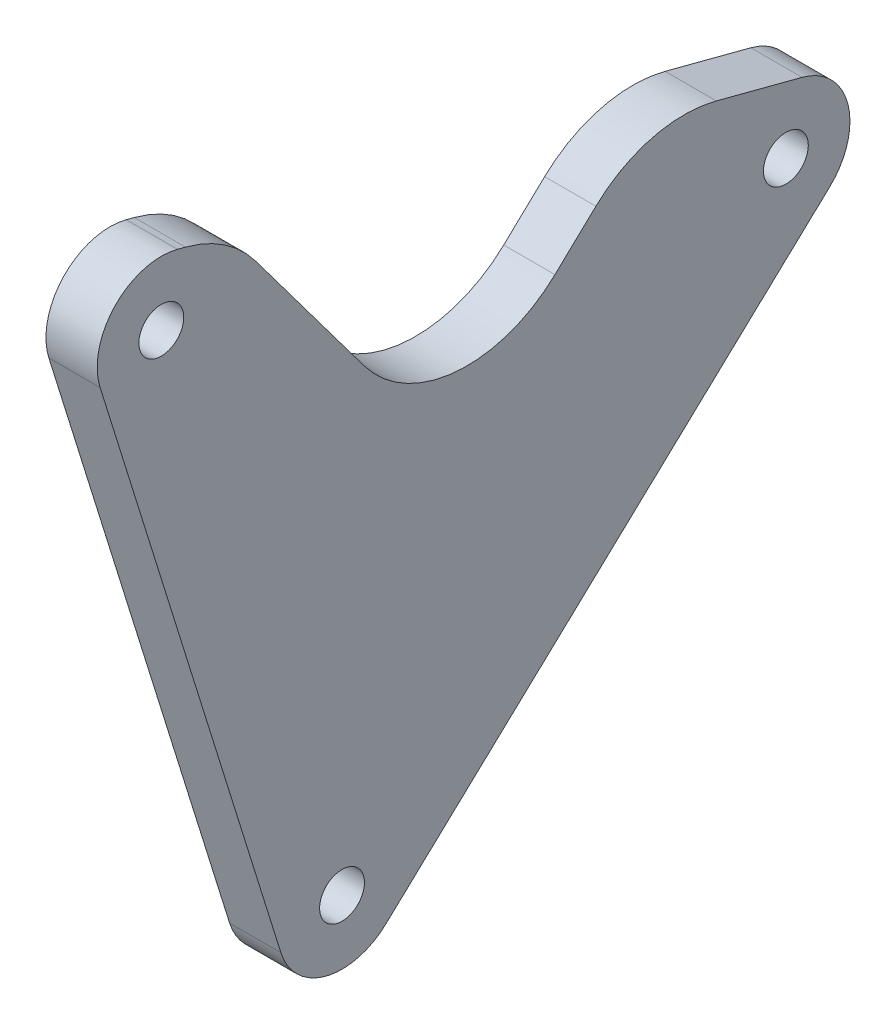
ISO-10303-21;
HEADER;
FILE_DESCRIPTION(('STEP AP214'),'2;1');
FILE_NAME('part.step','',(''),(''),'','','');
FILE_SCHEMA(('AUTOMOTIVE_DESIGN { 1 0 10303 214 1 1 1 1 }'));
ENDSEC;
DATA;
#1=APPLICATION_CONTEXT('core data for automotive mechanical design processes');
#2=APPLICATION_PROTOCOL_DEFINITION('international standard','automotive_design',2000,#1);
#3=PRODUCT_CONTEXT('',#1,'mechanical');
#4=PRODUCT('Part','Part','',(#3));
#5=PRODUCT_RELATED_PRODUCT_CATEGORY('part','',(#4));
#6=PRODUCT_DEFINITION_FORMATION('','',#4);
#7=PRODUCT_DEFINITION_CONTEXT('part definition',#1,'design');
#8=PRODUCT_DEFINITION('design','',#6,#7);
#9=PRODUCT_DEFINITION_SHAPE('','',#8);
#10=(LENGTH_UNIT() NAMED_UNIT(*) SI_UNIT(.MILLI.,.METRE.));
#11=(NAMED_UNIT(*) PLANE_ANGLE_UNIT() SI_UNIT($,.RADIAN.));
#12=(NAMED_UNIT(*) SI_UNIT($,.STERADIAN.) SOLID_ANGLE_UNIT());
#13=UNCERTAINTY_MEASURE_WITH_UNIT(LENGTH_MEASURE(1.E-05),#10,'distance_accuracy_value','');
#14=(GEOMETRIC_REPRESENTATION_CONTEXT(3) GLOBAL_UNCERTAINTY_ASSIGNED_CONTEXT((#13)) GLOBAL_UNIT_ASSIGNED_CONTEXT((#10,
#11,#12)) REPRESENTATION_CONTEXT('',''));
#15=CARTESIAN_POINT('',(0.,0.,0.));
#16=DIRECTION('',(0.,0.,1.));
#17=DIRECTION('',(1.,0.,0.));
#18=AXIS2_PLACEMENT_3D('',#15,#16,#17);
#19=CARTESIAN_POINT('',(8.,-104.736710912887,-43.1273205562893));
#20=DIRECTION('',(-1.,0.,0.));
#21=DIRECTION('',(0.,0.,1.));
#22=AXIS2_PLACEMENT_3D('',#19,#20,#21);
#23=PLANE('',#22);
#24=CARTESIAN_POINT('',(8.,-104.736710912887,-43.1273205562893));
#25=DIRECTION('',(1.,0.,0.));
#26=DIRECTION('',(0.,0.,1.));
#27=AXIS2_PLACEMENT_3D('',#24,#25,#26);
#28=CIRCLE('',#27,9.99999999999999);
#29=CARTESIAN_POINT('',(8.,-107.713015918046,-33.5805091243891));
#30=VERTEX_POINT('',#29);
#31=CARTESIAN_POINT('',(8.,-112.029742303971,-49.9692276828626));
#32=VERTEX_POINT('',#31);
#33=EDGE_CURVE('E200',#30,#32,#28,.T.);
#34=ORIENTED_EDGE('',*,*,#33,.T.);
#35=DIRECTION('',(0.,0.684190712657331,-0.72930313910846));
#36=VECTOR('',#35,1.);
#37=CARTESIAN_POINT('',(8.,-47.0297423039711,-119.255032305867));
#38=LINE('',#37,#36);
#39=CARTESIAN_POINT('',(8.,-47.0297423039711,-119.255032305867));
#40=VERTEX_POINT('',#39);
#41=EDGE_CURVE('E112',#32,#40,#38,.T.);
#42=ORIENTED_EDGE('',*,*,#41,.T.);
#43=CARTESIAN_POINT('',(8.,-39.7367109128865,-112.413125179294));
#44=DIRECTION('',(1.,0.,0.));
#45=DIRECTION('',(0.,0.,-1.));
#46=AXIS2_PLACEMENT_3D('',#43,#44,#45);
#47=CIRCLE('',#46,10.);
#48=CARTESIAN_POINT('',(8.,-30.0621206860752,-114.943402623229));
#49=VERTEX_POINT('',#48);
#50=EDGE_CURVE('E237',#40,#49,#47,.T.);
#51=ORIENTED_EDGE('',*,*,#50,.T.);
#52=DIRECTION('',(0.,0.253027744393525,0.967459022681129));
#53=VECTOR('',#52,1.);
#54=CARTESIAN_POINT('',(8.,-26.5638508609774,-101.567665056678));
#55=LINE('',#54,#53);
#56=CARTESIAN_POINT('',(8.,-26.5638508609774,-101.567665056678));
#57=VERTEX_POINT('',#56);
#58=EDGE_CURVE('E257',#49,#57,#55,.T.);
#59=ORIENTED_EDGE('',*,*,#58,.T.);
#60=CARTESIAN_POINT('',(8.,-45.9130313146,-96.5071101688079));
#61=DIRECTION('',(1.,0.,0.));
#62=DIRECTION('',(0.,0.,1.));
#63=AXIS2_PLACEMENT_3D('',#60,#61,#62);
#64=CIRCLE('',#63,20.);
#65=CARTESIAN_POINT('',(8.,-31.3927790692278,-82.7534824753314));
#66=VERTEX_POINT('',#65);
#67=EDGE_CURVE('E253',#57,#66,#64,.T.);
#68=ORIENTED_EDGE('',*,*,#67,.T.);
#69=DIRECTION('',(0.,-0.687681384673827,0.726012612268607));
#70=VECTOR('',#69,1.);
#71=CARTESIAN_POINT('',(8.,-37.4436249657284,-76.36536359694));
#72=LINE('',#71,#70);
#73=CARTESIAN_POINT('',(8.,-37.4436249657284,-76.36536359694));
#74=VERTEX_POINT('',#73);
#75=EDGE_CURVE('E256',#66,#74,#72,.T.);
#76=ORIENTED_EDGE('',*,*,#75,.T.);
#77=CARTESIAN_POINT('',(8.,-22.9233727203562,-62.6117359034635));
#78=DIRECTION('',(-1.,0.,0.));
#79=DIRECTION('',(0.,0.,1.));
#80=AXIS2_PLACEMENT_3D('',#77,#78,#79);
#81=CIRCLE('',#80,20.);
#82=CARTESIAN_POINT('',(8.,-34.9077564524772,-46.6000356014569));
#83=VERTEX_POINT('',#82);
#84=EDGE_CURVE('E261',#74,#83,#81,.T.);
#85=ORIENTED_EDGE('',*,*,#84,.T.);
#86=DIRECTION('',(0.,0.800585015100326,0.599219186606046));
#87=VECTOR('',#86,1.);
#88=CARTESIAN_POINT('',(8.,-12.2536975702267,-29.6440016004378));
#89=LINE('',#88,#87);
#90=CARTESIAN_POINT('',(8.,-12.2536975702267,-29.6440016004378));
#91=VERTEX_POINT('',#90);
#92=EDGE_CURVE('E268',#83,#91,#89,.T.);
#93=ORIENTED_EDGE('',*,*,#92,.T.);
#94=CARTESIAN_POINT('',(8.,-24.2380813023477,-13.6323012984312));
#95=DIRECTION('',(1.,0.,0.));
#96=DIRECTION('',(0.,0.,1.));
#97=AXIS2_PLACEMENT_3D('',#94,#95,#96);
#98=CIRCLE('',#97,20.);
#99=CARTESIAN_POINT('',(8.,-4.88890084872509,-18.6928561863018));
#100=VERTEX_POINT('',#99);
#101=EDGE_CURVE('E143',#91,#100,#98,.T.);
#102=ORIENTED_EDGE('',*,*,#101,.T.);
#103=DIRECTION('',(0.,0.253027744393524,0.967459022681129));
#104=VECTOR('',#103,1.);
#105=CARTESIAN_POINT('',(8.,-4.56212068607523,-17.4434026232288));
#106=LINE('',#105,#104);
#107=CARTESIAN_POINT('',(8.,-4.56212068607523,-17.4434026232288));
#108=VERTEX_POINT('',#107);
#109=EDGE_CURVE('E137',#100,#108,#106,.T.);
#110=ORIENTED_EDGE('',*,*,#109,.T.);
#111=CARTESIAN_POINT('',(8.,-14.2367109128865,-14.9131251792935));
#112=DIRECTION('',(1.,0.,0.));
#113=DIRECTION('',(0.,0.,1.));
#114=AXIS2_PLACEMENT_3D('',#111,#112,#113);
#115=CIRCLE('',#114,10.);
#116=CARTESIAN_POINT('',(8.,-17.2130159180464,-5.36631374739335));
#117=VERTEX_POINT('',#116);
#118=EDGE_CURVE('E141',#108,#117,#115,.T.);
#119=ORIENTED_EDGE('',*,*,#118,.T.);
#120=DIRECTION('',(0.,-0.95468114319002,-0.297630500515987));
#121=VECTOR('',#120,1.);
#122=CARTESIAN_POINT('',(8.,-107.713015918046,-33.5805091243891));
#123=LINE('',#122,#121);
#124=EDGE_CURVE('E57',#117,#30,#123,.T.);
#125=ORIENTED_EDGE('',*,*,#124,.T.);
#126=EDGE_LOOP('',(#34,#42,#51,#59,#68,#76,#85,#93,#102,#110,#119,#125));
#127=FACE_BOUND('',#126,.T.);
#128=CARTESIAN_POINT('',(8.,-39.7367109128865,-112.413125179294));
#129=DIRECTION('',(1.,0.,0.));
#130=DIRECTION('',(0.,0.,-1.));
#131=AXIS2_PLACEMENT_3D('',#128,#129,#130);
#132=CIRCLE('',#131,3.50000000000001);
#133=CARTESIAN_POINT('',(8.,-39.7367109128865,-115.913125179294));
#134=VERTEX_POINT('',#133);
#135=EDGE_CURVE('E170',#134,#134,#132,.T.);
#136=ORIENTED_EDGE('',*,*,#135,.F.);
#137=EDGE_LOOP('',(#136));
#138=FACE_BOUND('',#137,.T.);
#139=CARTESIAN_POINT('',(8.,-104.736710912887,-43.1273205562893));
#140=DIRECTION('',(1.,0.,0.));
#141=DIRECTION('',(0.,0.,-1.));
#142=AXIS2_PLACEMENT_3D('',#139,#140,#141);
#143=CIRCLE('',#142,3.5);
#144=CARTESIAN_POINT('',(8.,-104.736710912887,-46.6273205562893));
#145=VERTEX_POINT('',#144);
#146=EDGE_CURVE('E326',#145,#145,#143,.T.);
#147=ORIENTED_EDGE('',*,*,#146,.F.);
#148=EDGE_LOOP('',(#147));
#149=FACE_BOUND('',#148,.T.);
#150=CARTESIAN_POINT('',(8.,-14.2367109128865,-14.9131251792935));
#151=DIRECTION('',(1.,0.,0.));
#152=DIRECTION('',(0.,0.,-1.));
#153=AXIS2_PLACEMENT_3D('',#150,#151,#152);
#154=CIRCLE('',#153,3.5);
#155=CARTESIAN_POINT('',(8.,-14.2367109128865,-18.4131251792936));
#156=VERTEX_POINT('',#155);
#157=EDGE_CURVE('E315',#156,#156,#154,.T.);
#158=ORIENTED_EDGE('',*,*,#157,.F.);
#159=EDGE_LOOP('',(#158));
#160=FACE_BOUND('',#159,.T.);
#161=ADVANCED_FACE('F39',(#127,#138,#149,#160),#23,.F.);
#162=CARTESIAN_POINT('',(0.,-104.736710912887,-43.1273205562893));
#163=DIRECTION('',(-1.,0.,0.));
#164=DIRECTION('',(0.,0.,1.));
#165=AXIS2_PLACEMENT_3D('',#162,#163,#164);
#166=PLANE('',#165);
#167=CARTESIAN_POINT('',(0.,-104.736710912887,-43.1273205562893));
#168=DIRECTION('',(1.,0.,0.));
#169=DIRECTION('',(0.,0.,-1.));
#170=AXIS2_PLACEMENT_3D('',#167,#168,#169);
#171=CIRCLE('',#170,3.5);
#172=CARTESIAN_POINT('',(0.,-104.736710912887,-46.6273205562893));
#173=VERTEX_POINT('',#172);
#174=EDGE_CURVE('E323',#173,#173,#171,.T.);
#175=ORIENTED_EDGE('',*,*,#174,.T.);
#176=EDGE_LOOP('',(#175));
#177=FACE_BOUND('',#176,.T.);
#178=CARTESIAN_POINT('',(0.,-104.736710912887,-43.1273205562893));
#179=DIRECTION('',(1.,0.,0.));
#180=DIRECTION('',(0.,0.,1.));
#181=AXIS2_PLACEMENT_3D('',#178,#179,#180);
#182=CIRCLE('',#181,9.99999999999999);
#183=CARTESIAN_POINT('',(0.,-107.713015918046,-33.5805091243891));
#184=VERTEX_POINT('',#183);
#185=CARTESIAN_POINT('',(0.,-112.029742303971,-49.9692276828626));
#186=VERTEX_POINT('',#185);
#187=EDGE_CURVE('E165',#184,#186,#182,.T.);
#188=ORIENTED_EDGE('',*,*,#187,.F.);
#189=DIRECTION('',(0.,-0.95468114319002,-0.297630500515987));
#190=VECTOR('',#189,1.);
#191=CARTESIAN_POINT('',(0.,-107.713015918046,-33.5805091243891));
#192=LINE('',#191,#190);
#193=CARTESIAN_POINT('',(0.,-17.2130159180464,-5.36631374739335));
#194=VERTEX_POINT('',#193);
#195=EDGE_CURVE('E104',#194,#184,#192,.T.);
#196=ORIENTED_EDGE('',*,*,#195,.F.);
#197=CARTESIAN_POINT('',(0.,-14.2367109128865,-14.9131251792935));
#198=DIRECTION('',(1.,0.,0.));
#199=DIRECTION('',(0.,0.,1.));
#200=AXIS2_PLACEMENT_3D('',#197,#198,#199);
#201=CIRCLE('',#200,10.);
#202=CARTESIAN_POINT('',(0.,-4.56212068607523,-17.4434026232288));
#203=VERTEX_POINT('',#202);
#204=EDGE_CURVE('E98',#203,#194,#201,.T.);
#205=ORIENTED_EDGE('',*,*,#204,.F.);
#206=DIRECTION('',(0.,0.253027744393524,0.967459022681129));
#207=VECTOR('',#206,1.);
#208=CARTESIAN_POINT('',(0.,-4.56212068607523,-17.4434026232288));
#209=LINE('',#208,#207);
#210=CARTESIAN_POINT('',(0.,-4.88890084872509,-18.6928561863018));
#211=VERTEX_POINT('',#210);
#212=EDGE_CURVE('E152',#211,#203,#209,.T.);
#213=ORIENTED_EDGE('',*,*,#212,.F.);
#214=CARTESIAN_POINT('',(0.,-24.2380813023477,-13.6323012984312));
#215=DIRECTION('',(1.,0.,0.));
#216=DIRECTION('',(0.,0.,1.));
#217=AXIS2_PLACEMENT_3D('',#214,#215,#216);
#218=CIRCLE('',#217,20.);
#219=CARTESIAN_POINT('',(0.,-12.2536975702267,-29.6440016004378));
#220=VERTEX_POINT('',#219);
#221=EDGE_CURVE('E191',#220,#211,#218,.T.);
#222=ORIENTED_EDGE('',*,*,#221,.F.);
#223=DIRECTION('',(0.,0.800585015100326,0.599219186606046));
#224=VECTOR('',#223,1.);
#225=CARTESIAN_POINT('',(0.,-12.2536975702267,-29.6440016004378));
#226=LINE('',#225,#224);
#227=CARTESIAN_POINT('',(0.,-34.9077564524772,-46.6000356014569));
#228=VERTEX_POINT('',#227);
#229=EDGE_CURVE('E188',#228,#220,#226,.T.);
#230=ORIENTED_EDGE('',*,*,#229,.F.);
#231=CARTESIAN_POINT('',(0.,-22.9233727203562,-62.6117359034635));
#232=DIRECTION('',(-1.,0.,0.));
#233=DIRECTION('',(0.,0.,1.));
#234=AXIS2_PLACEMENT_3D('',#231,#232,#233);
#235=CIRCLE('',#234,20.);
#236=CARTESIAN_POINT('',(0.,-37.4436249657284,-76.36536359694));
#237=VERTEX_POINT('',#236);
#238=EDGE_CURVE('E185',#237,#228,#235,.T.);
#239=ORIENTED_EDGE('',*,*,#238,.F.);
#240=DIRECTION('',(0.,-0.687681384673827,0.726012612268607));
#241=VECTOR('',#240,1.);
#242=CARTESIAN_POINT('',(0.,-37.4436249657284,-76.36536359694));
#243=LINE('',#242,#241);
#244=CARTESIAN_POINT('',(0.,-31.3927790692278,-82.7534824753314));
#245=VERTEX_POINT('',#244);
#246=EDGE_CURVE('E182',#245,#237,#243,.T.);
#247=ORIENTED_EDGE('',*,*,#246,.F.);
#248=CARTESIAN_POINT('',(0.,-45.9130313146,-96.5071101688079));
#249=DIRECTION('',(1.,0.,0.));
#250=DIRECTION('',(0.,0.,1.));
#251=AXIS2_PLACEMENT_3D('',#248,#249,#250);
#252=CIRCLE('',#251,20.);
#253=CARTESIAN_POINT('',(0.,-26.5638508609774,-101.567665056678));
#254=VERTEX_POINT('',#253);
#255=EDGE_CURVE('E179',#254,#245,#252,.T.);
#256=ORIENTED_EDGE('',*,*,#255,.F.);
#257=DIRECTION('',(0.,0.253027744393525,0.967459022681129));
#258=VECTOR('',#257,1.);
#259=CARTESIAN_POINT('',(0.,-26.5638508609774,-101.567665056678));
#260=LINE('',#259,#258);
#261=CARTESIAN_POINT('',(0.,-30.0621206860752,-114.943402623229));
#262=VERTEX_POINT('',#261);
#263=EDGE_CURVE('E176',#262,#254,#260,.T.);
#264=ORIENTED_EDGE('',*,*,#263,.F.);
#265=CARTESIAN_POINT('',(0.,-39.7367109128865,-112.413125179294));
#266=DIRECTION('',(1.,0.,0.));
#267=DIRECTION('',(0.,0.,-1.));
#268=AXIS2_PLACEMENT_3D('',#265,#266,#267);
#269=CIRCLE('',#268,10.);
#270=CARTESIAN_POINT('',(0.,-47.0297423039711,-119.255032305867));
#271=VERTEX_POINT('',#270);
#272=EDGE_CURVE('E173',#271,#262,#269,.T.);
#273=ORIENTED_EDGE('',*,*,#272,.F.);
#274=DIRECTION('',(0.,0.684190712657331,-0.72930313910846));
#275=VECTOR('',#274,1.);
#276=CARTESIAN_POINT('',(0.,-47.0297423039711,-119.255032305867));
#277=LINE('',#276,#275);
#278=EDGE_CURVE('E169',#186,#271,#277,.T.);
#279=ORIENTED_EDGE('',*,*,#278,.F.);
#280=EDGE_LOOP('',(#188,#196,#205,#213,#222,#230,#239,#247,#256,#264,#273,#279));
#281=FACE_BOUND('',#280,.T.);
#282=CARTESIAN_POINT('',(0.,-39.7367109128865,-112.413125179294));
#283=DIRECTION('',(1.,0.,0.));
#284=DIRECTION('',(0.,0.,-1.));
#285=AXIS2_PLACEMENT_3D('',#282,#283,#284);
#286=CIRCLE('',#285,3.50000000000001);
#287=CARTESIAN_POINT('',(0.,-39.7367109128865,-115.913125179294));
#288=VERTEX_POINT('',#287);
#289=EDGE_CURVE('E330',#288,#288,#286,.T.);
#290=ORIENTED_EDGE('',*,*,#289,.T.);
#291=EDGE_LOOP('',(#290));
#292=FACE_BOUND('',#291,.T.);
#293=CARTESIAN_POINT('',(0.,-14.2367109128865,-14.9131251792935));
#294=DIRECTION('',(1.,0.,0.));
#295=DIRECTION('',(0.,0.,-1.));
#296=AXIS2_PLACEMENT_3D('',#293,#294,#295);
#297=CIRCLE('',#296,3.5);
#298=CARTESIAN_POINT('',(0.,-14.2367109128865,-18.4131251792936));
#299=VERTEX_POINT('',#298);
#300=EDGE_CURVE('E318',#299,#299,#297,.T.);
#301=ORIENTED_EDGE('',*,*,#300,.T.);
#302=EDGE_LOOP('',(#301));
#303=FACE_BOUND('',#302,.T.);
#304=ADVANCED_FACE('F241',(#177,#281,#292,#303),#166,.T.);
#305=CARTESIAN_POINT('',(8.,-104.736710912887,-43.1273205562893));
#306=DIRECTION('',(-1.,0.,0.));
#307=DIRECTION('',(0.,0.,1.));
#308=AXIS2_PLACEMENT_3D('',#305,#306,#307);
#309=CYLINDRICAL_SURFACE('',#308,9.99999999999999);
#310=ORIENTED_EDGE('',*,*,#187,.T.);
#311=DIRECTION('',(-1.,0.,0.));
#312=VECTOR('',#311,1.);
#313=CARTESIAN_POINT('',(8.,-112.029742303971,-49.9692276828626));
#314=LINE('',#313,#312);
#315=EDGE_CURVE('E11',#32,#186,#314,.T.);
#316=ORIENTED_EDGE('',*,*,#315,.F.);
#317=ORIENTED_EDGE('',*,*,#33,.F.);
#318=DIRECTION('',(-1.,0.,0.));
#319=VECTOR('',#318,1.);
#320=CARTESIAN_POINT('',(8.,-107.713015918046,-33.5805091243891));
#321=LINE('',#320,#319);
#322=EDGE_CURVE('E161',#30,#184,#321,.T.);
#323=ORIENTED_EDGE('',*,*,#322,.T.);
#324=EDGE_LOOP('',(#310,#316,#317,#323));
#325=FACE_BOUND('',#324,.T.);
#326=ADVANCED_FACE('F41',(#325),#309,.T.);
#327=CARTESIAN_POINT('',(8.,-47.0297423039711,-119.255032305867));
#328=DIRECTION('',(0.,0.72930313910846,0.684190712657331));
#329=DIRECTION('',(0.,-0.684190712657331,0.72930313910846));
#330=AXIS2_PLACEMENT_3D('',#327,#328,#329);
#331=PLANE('',#330);
#332=ORIENTED_EDGE('',*,*,#278,.T.);
#333=DIRECTION('',(-1.,0.,0.));
#334=VECTOR('',#333,1.);
#335=CARTESIAN_POINT('',(8.,-47.0297423039711,-119.255032305867));
#336=LINE('',#335,#334);
#337=EDGE_CURVE('E49',#40,#271,#336,.T.);
#338=ORIENTED_EDGE('',*,*,#337,.F.);
#339=ORIENTED_EDGE('',*,*,#41,.F.);
#340=ORIENTED_EDGE('',*,*,#315,.T.);
#341=EDGE_LOOP('',(#332,#338,#339,#340));
#342=FACE_BOUND('',#341,.T.);
#343=ADVANCED_FACE('F439',(#342),#331,.F.);
#344=CARTESIAN_POINT('',(8.,-39.7367109128865,-112.413125179294));
#345=DIRECTION('',(-1.,0.,0.));
#346=DIRECTION('',(0.,0.,1.));
#347=AXIS2_PLACEMENT_3D('',#344,#345,#346);
#348=CYLINDRICAL_SURFACE('',#347,10.);
#349=ORIENTED_EDGE('',*,*,#272,.T.);
#350=DIRECTION('',(-1.,0.,0.));
#351=VECTOR('',#350,1.);
#352=CARTESIAN_POINT('',(8.,-30.0621206860752,-114.943402623229));
#353=LINE('',#352,#351);
#354=EDGE_CURVE('E227',#49,#262,#353,.T.);
#355=ORIENTED_EDGE('',*,*,#354,.F.);
#356=ORIENTED_EDGE('',*,*,#50,.F.);
#357=ORIENTED_EDGE('',*,*,#337,.T.);
#358=EDGE_LOOP('',(#349,#355,#356,#357));
#359=FACE_BOUND('',#358,.T.);
#360=ADVANCED_FACE('F235',(#359),#348,.T.);
#361=CARTESIAN_POINT('',(8.,-26.5638508609774,-101.567665056678));
#362=DIRECTION('',(0.,-0.967459022681129,0.253027744393525));
#363=DIRECTION('',(0.,-0.253027744393525,-0.967459022681129));
#364=AXIS2_PLACEMENT_3D('',#361,#362,#363);
#365=PLANE('',#364);
#366=ORIENTED_EDGE('',*,*,#263,.T.);
#367=DIRECTION('',(-1.,0.,0.));
#368=VECTOR('',#367,1.);
#369=CARTESIAN_POINT('',(8.,-26.5638508609774,-101.567665056678));
#370=LINE('',#369,#368);
#371=EDGE_CURVE('E223',#57,#254,#370,.T.);
#372=ORIENTED_EDGE('',*,*,#371,.F.);
#373=ORIENTED_EDGE('',*,*,#58,.F.);
#374=ORIENTED_EDGE('',*,*,#354,.T.);
#375=EDGE_LOOP('',(#366,#372,#373,#374));
#376=FACE_BOUND('',#375,.T.);
#377=ADVANCED_FACE('F247',(#376),#365,.F.);
#378=CARTESIAN_POINT('',(8.,-45.9130313146,-96.5071101688079));
#379=DIRECTION('',(-1.,0.,0.));
#380=DIRECTION('',(0.,0.,1.));
#381=AXIS2_PLACEMENT_3D('',#378,#379,#380);
#382=CYLINDRICAL_SURFACE('',#381,20.);
#383=ORIENTED_EDGE('',*,*,#255,.T.);
#384=DIRECTION('',(-1.,0.,0.));
#385=VECTOR('',#384,1.);
#386=CARTESIAN_POINT('',(8.,-31.3927790692278,-82.7534824753314));
#387=LINE('',#386,#385);
#388=EDGE_CURVE('E219',#66,#245,#387,.T.);
#389=ORIENTED_EDGE('',*,*,#388,.F.);
#390=ORIENTED_EDGE('',*,*,#67,.F.);
#391=ORIENTED_EDGE('',*,*,#371,.T.);
#392=EDGE_LOOP('',(#383,#389,#390,#391));
#393=FACE_BOUND('',#392,.T.);
#394=ADVANCED_FACE('F251',(#393),#382,.T.);
#395=CARTESIAN_POINT('',(8.,-37.4436249657284,-76.36536359694));
#396=DIRECTION('',(0.,-0.726012612268607,-0.687681384673828));
#397=DIRECTION('',(0.,0.687681384673828,-0.726012612268607));
#398=AXIS2_PLACEMENT_3D('',#395,#396,#397);
#399=PLANE('',#398);
#400=ORIENTED_EDGE('',*,*,#246,.T.);
#401=DIRECTION('',(-1.,0.,0.));
#402=VECTOR('',#401,1.);
#403=CARTESIAN_POINT('',(8.,-37.4436249657284,-76.36536359694));
#404=LINE('',#403,#402);
#405=EDGE_CURVE('E215',#74,#237,#404,.T.);
#406=ORIENTED_EDGE('',*,*,#405,.F.);
#407=ORIENTED_EDGE('',*,*,#75,.F.);
#408=ORIENTED_EDGE('',*,*,#388,.T.);
#409=EDGE_LOOP('',(#400,#406,#407,#408));
#410=FACE_BOUND('',#409,.T.);
#411=ADVANCED_FACE('F404',(#410),#399,.F.);
#412=CARTESIAN_POINT('',(8.,-22.9233727203562,-62.6117359034635));
#413=DIRECTION('',(-1.,0.,0.));
#414=DIRECTION('',(0.,0.,1.));
#415=AXIS2_PLACEMENT_3D('',#412,#413,#414);
#416=CYLINDRICAL_SURFACE('',#415,20.);
#417=ORIENTED_EDGE('',*,*,#238,.T.);
#418=DIRECTION('',(-1.,0.,0.));
#419=VECTOR('',#418,1.);
#420=CARTESIAN_POINT('',(8.,-34.9077564524772,-46.6000356014569));
#421=LINE('',#420,#419);
#422=EDGE_CURVE('E211',#83,#228,#421,.T.);
#423=ORIENTED_EDGE('',*,*,#422,.F.);
#424=ORIENTED_EDGE('',*,*,#84,.F.);
#425=ORIENTED_EDGE('',*,*,#405,.T.);
#426=EDGE_LOOP('',(#417,#423,#424,#425));
#427=FACE_BOUND('',#426,.T.);
#428=ADVANCED_FACE('F395',(#427),#416,.F.);
#429=CARTESIAN_POINT('',(8.,-12.2536975702267,-29.6440016004378));
#430=DIRECTION('',(0.,-0.599219186606046,0.800585015100326));
#431=DIRECTION('',(0.,-0.800585015100326,-0.599219186606046));
#432=AXIS2_PLACEMENT_3D('',#429,#430,#431);
#433=PLANE('',#432);
#434=ORIENTED_EDGE('',*,*,#229,.T.);
#435=DIRECTION('',(-1.,0.,0.));
#436=VECTOR('',#435,1.);
#437=CARTESIAN_POINT('',(8.,-12.2536975702267,-29.6440016004378));
#438=LINE('',#437,#436);
#439=EDGE_CURVE('E207',#91,#220,#438,.T.);
#440=ORIENTED_EDGE('',*,*,#439,.F.);
#441=ORIENTED_EDGE('',*,*,#92,.F.);
#442=ORIENTED_EDGE('',*,*,#422,.T.);
#443=EDGE_LOOP('',(#434,#440,#441,#442));
#444=FACE_BOUND('',#443,.T.);
#445=ADVANCED_FACE('F276',(#444),#433,.F.);
#446=CARTESIAN_POINT('',(8.,-24.2380813023477,-13.6323012984312));
#447=DIRECTION('',(-1.,0.,0.));
#448=DIRECTION('',(0.,0.,1.));
#449=AXIS2_PLACEMENT_3D('',#446,#447,#448);
#450=CYLINDRICAL_SURFACE('',#449,20.);
#451=ORIENTED_EDGE('',*,*,#221,.T.);
#452=DIRECTION('',(-1.,0.,0.));
#453=VECTOR('',#452,1.);
#454=CARTESIAN_POINT('',(8.,-4.88890084872509,-18.6928561863018));
#455=LINE('',#454,#453);
#456=EDGE_CURVE('E154',#100,#211,#455,.T.);
#457=ORIENTED_EDGE('',*,*,#456,.F.);
#458=ORIENTED_EDGE('',*,*,#101,.F.);
#459=ORIENTED_EDGE('',*,*,#439,.T.);
#460=EDGE_LOOP('',(#451,#457,#458,#459));
#461=FACE_BOUND('',#460,.T.);
#462=ADVANCED_FACE('F280',(#461),#450,.T.);
#463=CARTESIAN_POINT('',(8.,-4.56212068607523,-17.4434026232288));
#464=DIRECTION('',(0.,-0.967459022681129,0.253027744393524));
#465=DIRECTION('',(0.,-0.253027744393524,-0.967459022681129));
#466=AXIS2_PLACEMENT_3D('',#463,#464,#465);
#467=PLANE('',#466);
#468=ORIENTED_EDGE('',*,*,#212,.T.);
#469=DIRECTION('',(-1.,0.,0.));
#470=VECTOR('',#469,1.);
#471=CARTESIAN_POINT('',(8.,-4.56212068607523,-17.4434026232288));
#472=LINE('',#471,#470);
#473=EDGE_CURVE('E149',#108,#203,#472,.T.);
#474=ORIENTED_EDGE('',*,*,#473,.F.);
#475=ORIENTED_EDGE('',*,*,#109,.F.);
#476=ORIENTED_EDGE('',*,*,#456,.T.);
#477=EDGE_LOOP('',(#468,#474,#475,#476));
#478=FACE_BOUND('',#477,.T.);
#479=ADVANCED_FACE('F150',(#478),#467,.F.);
#480=CARTESIAN_POINT('',(8.,-14.2367109128865,-14.9131251792935));
#481=DIRECTION('',(-1.,0.,0.));
#482=DIRECTION('',(0.,0.,1.));
#483=AXIS2_PLACEMENT_3D('',#480,#481,#482);
#484=CYLINDRICAL_SURFACE('',#483,10.);
#485=ORIENTED_EDGE('',*,*,#204,.T.);
#486=DIRECTION('',(-1.,0.,0.));
#487=VECTOR('',#486,1.);
#488=CARTESIAN_POINT('',(8.,-17.2130159180464,-5.36631374739335));
#489=LINE('',#488,#487);
#490=EDGE_CURVE('E155',#117,#194,#489,.T.);
#491=ORIENTED_EDGE('',*,*,#490,.F.);
#492=ORIENTED_EDGE('',*,*,#118,.F.);
#493=ORIENTED_EDGE('',*,*,#473,.T.);
#494=EDGE_LOOP('',(#485,#491,#492,#493));
#495=FACE_BOUND('',#494,.T.);
#496=ADVANCED_FACE('F157',(#495),#484,.T.);
#497=CARTESIAN_POINT('',(8.,-107.713015918046,-33.5805091243891));
#498=DIRECTION('',(0.,0.297630500515987,-0.95468114319002));
#499=DIRECTION('',(0.,0.95468114319002,0.297630500515987));
#500=AXIS2_PLACEMENT_3D('',#497,#498,#499);
#501=PLANE('',#500);
#502=ORIENTED_EDGE('',*,*,#195,.T.);
#503=ORIENTED_EDGE('',*,*,#322,.F.);
#504=ORIENTED_EDGE('',*,*,#124,.F.);
#505=ORIENTED_EDGE('',*,*,#490,.T.);
#506=EDGE_LOOP('',(#502,#503,#504,#505));
#507=FACE_BOUND('',#506,.T.);
#508=ADVANCED_FACE('F284',(#507),#501,.F.);
#509=CARTESIAN_POINT('',(8.,-39.7367109128865,-112.413125179294));
#510=DIRECTION('',(-1.,0.,0.));
#511=DIRECTION('',(0.,0.,1.));
#512=AXIS2_PLACEMENT_3D('',#509,#510,#511);
#513=CYLINDRICAL_SURFACE('',#512,3.50000000000001);
#514=ORIENTED_EDGE('',*,*,#135,.T.);
#515=EDGE_LOOP('',(#514));
#516=FACE_BOUND('',#515,.T.);
#517=ORIENTED_EDGE('',*,*,#289,.F.);
#518=EDGE_LOOP('',(#517));
#519=FACE_BOUND('',#518,.T.);
#520=ADVANCED_FACE('F286',(#516,#519),#513,.F.);
#521=CARTESIAN_POINT('',(8.,-104.736710912887,-43.1273205562893));
#522=DIRECTION('',(-1.,0.,0.));
#523=DIRECTION('',(0.,0.,1.));
#524=AXIS2_PLACEMENT_3D('',#521,#522,#523);
#525=CYLINDRICAL_SURFACE('',#524,3.5);
#526=ORIENTED_EDGE('',*,*,#146,.T.);
#527=EDGE_LOOP('',(#526));
#528=FACE_BOUND('',#527,.T.);
#529=ORIENTED_EDGE('',*,*,#174,.F.);
#530=EDGE_LOOP('',(#529));
#531=FACE_BOUND('',#530,.T.);
#532=ADVANCED_FACE('F292',(#528,#531),#525,.F.);
#533=CARTESIAN_POINT('',(8.,-14.2367109128865,-14.9131251792935));
#534=DIRECTION('',(-1.,0.,0.));
#535=DIRECTION('',(0.,0.,1.));
#536=AXIS2_PLACEMENT_3D('',#533,#534,#535);
#537=CYLINDRICAL_SURFACE('',#536,3.5);
#538=ORIENTED_EDGE('',*,*,#157,.T.);
#539=EDGE_LOOP('',(#538));
#540=FACE_BOUND('',#539,.T.);
#541=ORIENTED_EDGE('',*,*,#300,.F.);
#542=EDGE_LOOP('',(#541));
#543=FACE_BOUND('',#542,.T.);
#544=ADVANCED_FACE('F306',(#540,#543),#537,.F.);
#545=CLOSED_SHELL('',(#161,#304,#326,#343,#360,#377,#394,#411,#428,#445,#462,#479,#496,#508,
#520,#532,#544));
#546=MANIFOLD_SOLID_BREP('B2',#545);
#547=ADVANCED_BREP_SHAPE_REPRESENTATION('',(#18,#546),#14);
#548=SHAPE_DEFINITION_REPRESENTATION(#9,#547);
ENDSEC;
END-ISO-10303-21;
